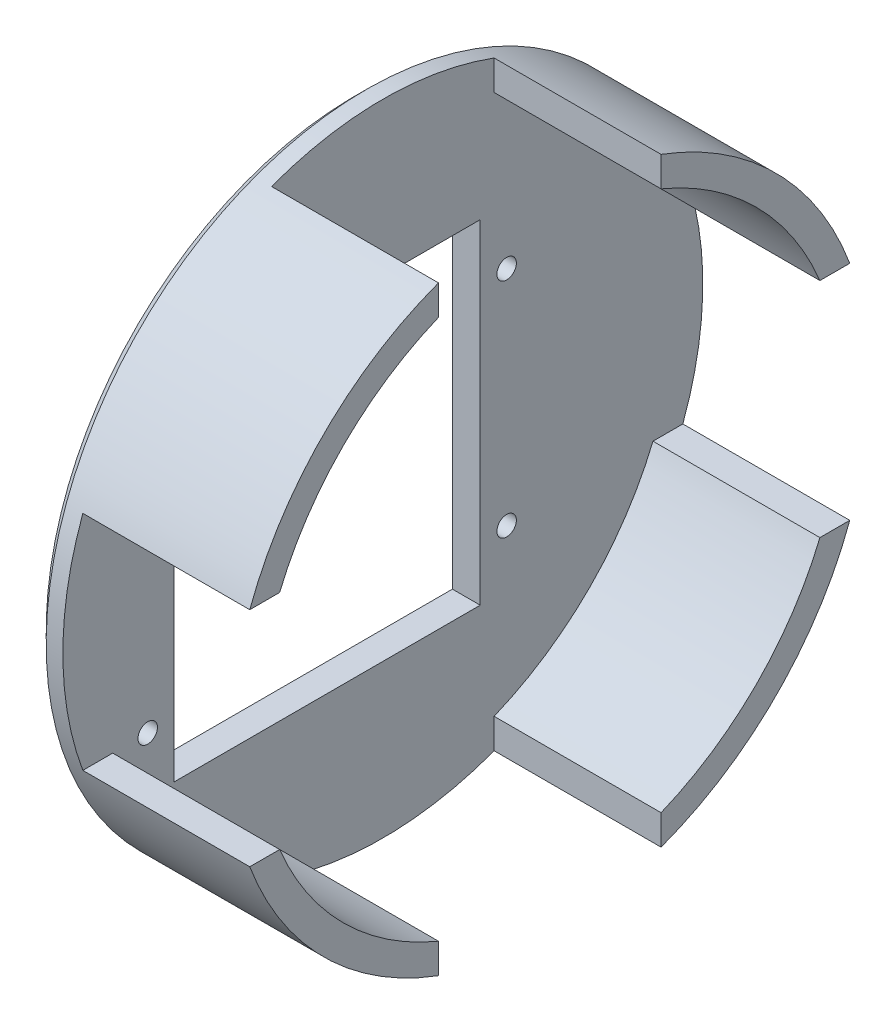
ISO-10303-21;
HEADER;
FILE_DESCRIPTION(('STEP AP214'),'2;1');
FILE_NAME('part.step','',(''),(''),'','','');
FILE_SCHEMA(('AUTOMOTIVE_DESIGN { 1 0 10303 214 1 1 1 1 }'));
ENDSEC;
DATA;
#1=APPLICATION_CONTEXT('core data for automotive mechanical design processes');
#2=APPLICATION_PROTOCOL_DEFINITION('international standard','automotive_design',2000,#1);
#3=PRODUCT_CONTEXT('',#1,'mechanical');
#4=PRODUCT('Part','Part','',(#3));
#5=PRODUCT_RELATED_PRODUCT_CATEGORY('part','',(#4));
#6=PRODUCT_DEFINITION_FORMATION('','',#4);
#7=PRODUCT_DEFINITION_CONTEXT('part definition',#1,'design');
#8=PRODUCT_DEFINITION('design','',#6,#7);
#9=PRODUCT_DEFINITION_SHAPE('','',#8);
#10=(LENGTH_UNIT() NAMED_UNIT(*) SI_UNIT(.MILLI.,.METRE.));
#11=(NAMED_UNIT(*) PLANE_ANGLE_UNIT() SI_UNIT($,.RADIAN.));
#12=(NAMED_UNIT(*) SI_UNIT($,.STERADIAN.) SOLID_ANGLE_UNIT());
#13=UNCERTAINTY_MEASURE_WITH_UNIT(LENGTH_MEASURE(1.E-05),#10,'distance_accuracy_value','');
#14=(GEOMETRIC_REPRESENTATION_CONTEXT(3) GLOBAL_UNCERTAINTY_ASSIGNED_CONTEXT((#13)) GLOBAL_UNIT_ASSIGNED_CONTEXT((#10,
#11,#12)) REPRESENTATION_CONTEXT('',''));
#15=CARTESIAN_POINT('',(0.,0.,0.));
#16=DIRECTION('',(0.,0.,1.));
#17=DIRECTION('',(1.,0.,0.));
#18=AXIS2_PLACEMENT_3D('',#15,#16,#17);
#19=CARTESIAN_POINT('',(5.,0.,0.));
#20=DIRECTION('',(-1.,0.,0.));
#21=DIRECTION('',(0.,0.,1.));
#22=AXIS2_PLACEMENT_3D('',#19,#20,#21);
#23=CYLINDRICAL_SURFACE('',#22,57.5);
#24=CARTESIAN_POINT('',(2.00000000000003,0.,0.));
#25=DIRECTION('',(1.,0.,0.));
#26=DIRECTION('',(0.,0.,-1.));
#27=AXIS2_PLACEMENT_3D('',#24,#25,#26);
#28=CIRCLE('',#27,57.5);
#29=CARTESIAN_POINT('',(2.00000000000003,0.,-57.5));
#30=VERTEX_POINT('',#29);
#31=EDGE_CURVE('E48',#30,#30,#28,.T.);
#32=ORIENTED_EDGE('',*,*,#31,.T.);
#33=EDGE_LOOP('',(#32));
#34=FACE_BOUND('',#33,.T.);
#35=DIRECTION('',(1.,0.,0.));
#36=VECTOR('',#35,1.);
#37=CARTESIAN_POINT('',(5.,20.,53.9096466321196));
#38=LINE('',#37,#36);
#39=CARTESIAN_POINT('',(5.,20.,53.9096466321196));
#40=VERTEX_POINT('',#39);
#41=CARTESIAN_POINT('',(35.,20.,53.9096466321196));
#42=VERTEX_POINT('',#41);
#43=EDGE_CURVE('E177',#40,#42,#38,.T.);
#44=ORIENTED_EDGE('',*,*,#43,.T.);
#45=CARTESIAN_POINT('',(35.,0.,0.));
#46=DIRECTION('',(1.,0.,0.));
#47=DIRECTION('',(0.,0.,-1.));
#48=AXIS2_PLACEMENT_3D('',#45,#46,#47);
#49=CIRCLE('',#48,57.5);
#50=CARTESIAN_POINT('',(35.,53.9096466321196,20.));
#51=VERTEX_POINT('',#50);
#52=EDGE_CURVE('E342',#51,#42,#49,.T.);
#53=ORIENTED_EDGE('',*,*,#52,.F.);
#54=DIRECTION('',(1.,0.,0.));
#55=VECTOR('',#54,1.);
#56=CARTESIAN_POINT('',(5.,53.9096466321196,20.));
#57=LINE('',#56,#55);
#58=CARTESIAN_POINT('',(5.,53.9096466321196,20.));
#59=VERTEX_POINT('',#58);
#60=EDGE_CURVE('E230',#59,#51,#57,.T.);
#61=ORIENTED_EDGE('',*,*,#60,.F.);
#62=CARTESIAN_POINT('',(5.,0.,0.));
#63=DIRECTION('',(1.,0.,0.));
#64=DIRECTION('',(0.,0.,-1.));
#65=AXIS2_PLACEMENT_3D('',#62,#63,#64);
#66=CIRCLE('',#65,57.5);
#67=CARTESIAN_POINT('',(5.,53.9096466321196,-20.));
#68=VERTEX_POINT('',#67);
#69=EDGE_CURVE('E216',#68,#59,#66,.T.);
#70=ORIENTED_EDGE('',*,*,#69,.F.);
#71=DIRECTION('',(1.,0.,0.));
#72=VECTOR('',#71,1.);
#73=CARTESIAN_POINT('',(5.,53.9096466321196,-20.));
#74=LINE('',#73,#72);
#75=CARTESIAN_POINT('',(35.,53.9096466321196,-20.));
#76=VERTEX_POINT('',#75);
#77=EDGE_CURVE('E220',#68,#76,#74,.T.);
#78=ORIENTED_EDGE('',*,*,#77,.T.);
#79=CARTESIAN_POINT('',(35.,20.,-53.9096466321196));
#80=VERTEX_POINT('',#79);
#81=EDGE_CURVE('E338',#80,#76,#49,.T.);
#82=ORIENTED_EDGE('',*,*,#81,.F.);
#83=DIRECTION('',(1.,0.,0.));
#84=VECTOR('',#83,1.);
#85=CARTESIAN_POINT('',(5.,20.,-53.9096466321196));
#86=LINE('',#85,#84);
#87=CARTESIAN_POINT('',(5.,20.,-53.9096466321196));
#88=VERTEX_POINT('',#87);
#89=EDGE_CURVE('E251',#88,#80,#86,.T.);
#90=ORIENTED_EDGE('',*,*,#89,.F.);
#91=CARTESIAN_POINT('',(5.,0.,0.));
#92=DIRECTION('',(1.,0.,0.));
#93=DIRECTION('',(0.,0.,-1.));
#94=AXIS2_PLACEMENT_3D('',#91,#92,#93);
#95=CIRCLE('',#94,57.5);
#96=CARTESIAN_POINT('',(5.,-20.,-53.9096466321196));
#97=VERTEX_POINT('',#96);
#98=EDGE_CURVE('E237',#97,#88,#95,.T.);
#99=ORIENTED_EDGE('',*,*,#98,.F.);
#100=DIRECTION('',(1.,0.,0.));
#101=VECTOR('',#100,1.);
#102=CARTESIAN_POINT('',(5.,-20.,-53.9096466321196));
#103=LINE('',#102,#101);
#104=CARTESIAN_POINT('',(35.,-20.,-53.9096466321196));
#105=VERTEX_POINT('',#104);
#106=EDGE_CURVE('E241',#97,#105,#103,.T.);
#107=ORIENTED_EDGE('',*,*,#106,.T.);
#108=CARTESIAN_POINT('',(35.,-53.9096466321196,-20.));
#109=VERTEX_POINT('',#108);
#110=EDGE_CURVE('E336',#109,#105,#49,.T.);
#111=ORIENTED_EDGE('',*,*,#110,.F.);
#112=DIRECTION('',(1.,0.,0.));
#113=VECTOR('',#112,1.);
#114=CARTESIAN_POINT('',(5.,-53.9096466321196,-20.));
#115=LINE('',#114,#113);
#116=CARTESIAN_POINT('',(5.,-53.9096466321196,-20.));
#117=VERTEX_POINT('',#116);
#118=EDGE_CURVE('E264',#117,#109,#115,.T.);
#119=ORIENTED_EDGE('',*,*,#118,.F.);
#120=CARTESIAN_POINT('',(5.,0.,0.));
#121=DIRECTION('',(1.,0.,0.));
#122=DIRECTION('',(0.,0.,-1.));
#123=AXIS2_PLACEMENT_3D('',#120,#121,#122);
#124=CIRCLE('',#123,57.5);
#125=CARTESIAN_POINT('',(5.,-53.9096466321196,20.));
#126=VERTEX_POINT('',#125);
#127=EDGE_CURVE('E255',#126,#117,#124,.T.);
#128=ORIENTED_EDGE('',*,*,#127,.F.);
#129=DIRECTION('',(1.,0.,0.));
#130=VECTOR('',#129,1.);
#131=CARTESIAN_POINT('',(5.,-53.9096466321196,20.));
#132=LINE('',#131,#130);
#133=CARTESIAN_POINT('',(35.,-53.9096466321196,20.));
#134=VERTEX_POINT('',#133);
#135=EDGE_CURVE('E244',#126,#134,#132,.T.);
#136=ORIENTED_EDGE('',*,*,#135,.T.);
#137=CARTESIAN_POINT('',(35.,-20.0000000000001,53.9096466321195));
#138=VERTEX_POINT('',#137);
#139=EDGE_CURVE('E642',#138,#134,#49,.T.);
#140=ORIENTED_EDGE('',*,*,#139,.F.);
#141=DIRECTION('',(1.,0.,0.));
#142=VECTOR('',#141,1.);
#143=CARTESIAN_POINT('',(5.,-20.0000000000001,53.9096466321195));
#144=LINE('',#143,#142);
#145=CARTESIAN_POINT('',(5.,-20.0000000000001,53.9096466321195));
#146=VERTEX_POINT('',#145);
#147=EDGE_CURVE('E188',#146,#138,#144,.T.);
#148=ORIENTED_EDGE('',*,*,#147,.F.);
#149=CARTESIAN_POINT('',(5.,0.,0.));
#150=DIRECTION('',(1.,0.,0.));
#151=DIRECTION('',(0.,0.,-1.));
#152=AXIS2_PLACEMENT_3D('',#149,#150,#151);
#153=CIRCLE('',#152,57.5);
#154=EDGE_CURVE('E194',#40,#146,#153,.T.);
#155=ORIENTED_EDGE('',*,*,#154,.F.);
#156=EDGE_LOOP('',(#44,#53,#61,#70,#78,#82,#90,#99,#107,#111,#119,#128,#136,#140,#148,#155));
#157=FACE_BOUND('',#156,.T.);
#158=ADVANCED_FACE('F39',(#34,#157),#23,.T.);
#159=CARTESIAN_POINT('',(35.,0.,0.));
#160=DIRECTION('',(1.,0.,0.));
#161=DIRECTION('',(0.,0.,-1.));
#162=AXIS2_PLACEMENT_3D('',#159,#160,#161);
#163=PLANE('',#162);
#164=ORIENTED_EDGE('',*,*,#52,.T.);
#165=DIRECTION('',(0.,0.,-1.));
#166=VECTOR('',#165,1.);
#167=CARTESIAN_POINT('',(35.,20.,0.));
#168=LINE('',#167,#166);
#169=CARTESIAN_POINT('',(35.,20.,48.541219597369));
#170=VERTEX_POINT('',#169);
#171=EDGE_CURVE('E183',#42,#170,#168,.T.);
#172=ORIENTED_EDGE('',*,*,#171,.T.);
#173=CARTESIAN_POINT('',(35.,0.,0.));
#174=DIRECTION('',(1.,0.,0.));
#175=DIRECTION('',(0.,0.,-1.));
#176=AXIS2_PLACEMENT_3D('',#173,#174,#175);
#177=CIRCLE('',#176,52.5);
#178=CARTESIAN_POINT('',(35.,48.541219597369,20.));
#179=VERTEX_POINT('',#178);
#180=EDGE_CURVE('E337',#179,#170,#177,.T.);
#181=ORIENTED_EDGE('',*,*,#180,.F.);
#182=DIRECTION('',(0.,-1.,0.));
#183=VECTOR('',#182,1.);
#184=CARTESIAN_POINT('',(35.,0.,20.));
#185=LINE('',#184,#183);
#186=EDGE_CURVE('E217',#51,#179,#185,.T.);
#187=ORIENTED_EDGE('',*,*,#186,.F.);
#188=EDGE_LOOP('',(#164,#172,#181,#187));
#189=FACE_BOUND('',#188,.T.);
#190=ADVANCED_FACE('F360',(#189),#163,.T.);
#191=ORIENTED_EDGE('',*,*,#81,.T.);
#192=DIRECTION('',(0.,-1.,0.));
#193=VECTOR('',#192,1.);
#194=CARTESIAN_POINT('',(35.,0.,-20.));
#195=LINE('',#194,#193);
#196=CARTESIAN_POINT('',(35.,48.541219597369,-20.));
#197=VERTEX_POINT('',#196);
#198=EDGE_CURVE('E221',#76,#197,#195,.T.);
#199=ORIENTED_EDGE('',*,*,#198,.T.);
#200=CARTESIAN_POINT('',(35.,20.,-48.541219597369));
#201=VERTEX_POINT('',#200);
#202=EDGE_CURVE('E333',#201,#197,#177,.T.);
#203=ORIENTED_EDGE('',*,*,#202,.F.);
#204=DIRECTION('',(0.,0.,-1.));
#205=VECTOR('',#204,1.);
#206=CARTESIAN_POINT('',(35.,20.,0.));
#207=LINE('',#206,#205);
#208=EDGE_CURVE('E238',#201,#80,#207,.T.);
#209=ORIENTED_EDGE('',*,*,#208,.T.);
#210=EDGE_LOOP('',(#191,#199,#203,#209));
#211=FACE_BOUND('',#210,.T.);
#212=ADVANCED_FACE('F364',(#211),#163,.T.);
#213=DIRECTION('',(0.,0.,-1.));
#214=VECTOR('',#213,1.);
#215=CARTESIAN_POINT('',(35.,-20.,0.));
#216=LINE('',#215,#214);
#217=CARTESIAN_POINT('',(35.,-20.,48.541219597369));
#218=VERTEX_POINT('',#217);
#219=EDGE_CURVE('E198',#138,#218,#216,.T.);
#220=ORIENTED_EDGE('',*,*,#219,.F.);
#221=ORIENTED_EDGE('',*,*,#139,.T.);
#222=DIRECTION('',(0.,-1.,0.));
#223=VECTOR('',#222,1.);
#224=CARTESIAN_POINT('',(35.,0.,20.));
#225=LINE('',#224,#223);
#226=CARTESIAN_POINT('',(35.,-48.541219597369,20.));
#227=VERTEX_POINT('',#226);
#228=EDGE_CURVE('E259',#227,#134,#225,.T.);
#229=ORIENTED_EDGE('',*,*,#228,.F.);
#230=EDGE_CURVE('E643',#218,#227,#177,.T.);
#231=ORIENTED_EDGE('',*,*,#230,.F.);
#232=EDGE_LOOP('',(#220,#221,#229,#231));
#233=FACE_BOUND('',#232,.T.);
#234=ADVANCED_FACE('F381',(#233),#163,.T.);
#235=CARTESIAN_POINT('',(35.,0.,0.));
#236=DIRECTION('',(-1.,0.,0.));
#237=DIRECTION('',(0.,0.,1.));
#238=AXIS2_PLACEMENT_3D('',#235,#236,#237);
#239=CYLINDRICAL_SURFACE('',#238,52.5);
#240=ORIENTED_EDGE('',*,*,#180,.T.);
#241=DIRECTION('',(1.,0.,0.));
#242=VECTOR('',#241,1.);
#243=CARTESIAN_POINT('',(5.,20.,48.541219597369));
#244=LINE('',#243,#242);
#245=CARTESIAN_POINT('',(5.,20.,48.541219597369));
#246=VERTEX_POINT('',#245);
#247=EDGE_CURVE('E207',#246,#170,#244,.T.);
#248=ORIENTED_EDGE('',*,*,#247,.F.);
#249=CARTESIAN_POINT('',(5.,0.,0.));
#250=DIRECTION('',(1.,0.,0.));
#251=DIRECTION('',(0.,0.,-1.));
#252=AXIS2_PLACEMENT_3D('',#249,#250,#251);
#253=CIRCLE('',#252,52.5);
#254=CARTESIAN_POINT('',(5.,48.541219597369,20.));
#255=VERTEX_POINT('',#254);
#256=EDGE_CURVE('E197',#246,#255,#253,.F.);
#257=ORIENTED_EDGE('',*,*,#256,.T.);
#258=DIRECTION('',(1.,0.,0.));
#259=VECTOR('',#258,1.);
#260=CARTESIAN_POINT('',(5.,48.541219597369,20.));
#261=LINE('',#260,#259);
#262=EDGE_CURVE('E227',#255,#179,#261,.T.);
#263=ORIENTED_EDGE('',*,*,#262,.T.);
#264=EDGE_LOOP('',(#240,#248,#257,#263));
#265=FACE_BOUND('',#264,.T.);
#266=ADVANCED_FACE('F385',(#265),#239,.F.);
#267=ORIENTED_EDGE('',*,*,#202,.T.);
#268=DIRECTION('',(1.,0.,0.));
#269=VECTOR('',#268,1.);
#270=CARTESIAN_POINT('',(5.,48.541219597369,-20.));
#271=LINE('',#270,#269);
#272=CARTESIAN_POINT('',(5.,48.541219597369,-20.));
#273=VERTEX_POINT('',#272);
#274=EDGE_CURVE('E205',#273,#197,#271,.T.);
#275=ORIENTED_EDGE('',*,*,#274,.F.);
#276=CARTESIAN_POINT('',(5.,20.,-48.541219597369));
#277=VERTEX_POINT('',#276);
#278=EDGE_CURVE('E341',#273,#277,#253,.F.);
#279=ORIENTED_EDGE('',*,*,#278,.T.);
#280=DIRECTION('',(1.,0.,0.));
#281=VECTOR('',#280,1.);
#282=CARTESIAN_POINT('',(5.,20.,-48.541219597369));
#283=LINE('',#282,#281);
#284=EDGE_CURVE('E248',#277,#201,#283,.T.);
#285=ORIENTED_EDGE('',*,*,#284,.T.);
#286=EDGE_LOOP('',(#267,#275,#279,#285));
#287=FACE_BOUND('',#286,.T.);
#288=ADVANCED_FACE('F583',(#287),#239,.F.);
#289=DIRECTION('',(1.,0.,0.));
#290=VECTOR('',#289,1.);
#291=CARTESIAN_POINT('',(5.,-20.,48.541219597369));
#292=LINE('',#291,#290);
#293=CARTESIAN_POINT('',(5.,-20.,48.541219597369));
#294=VERTEX_POINT('',#293);
#295=EDGE_CURVE('E210',#294,#218,#292,.T.);
#296=ORIENTED_EDGE('',*,*,#295,.T.);
#297=ORIENTED_EDGE('',*,*,#230,.T.);
#298=DIRECTION('',(1.,0.,0.));
#299=VECTOR('',#298,1.);
#300=CARTESIAN_POINT('',(5.,-48.541219597369,20.));
#301=LINE('',#300,#299);
#302=CARTESIAN_POINT('',(5.,-48.541219597369,20.));
#303=VERTEX_POINT('',#302);
#304=EDGE_CURVE('E271',#303,#227,#301,.T.);
#305=ORIENTED_EDGE('',*,*,#304,.F.);
#306=EDGE_CURVE('E345',#303,#294,#253,.F.);
#307=ORIENTED_EDGE('',*,*,#306,.T.);
#308=EDGE_LOOP('',(#296,#297,#305,#307));
#309=FACE_BOUND('',#308,.T.);
#310=ADVANCED_FACE('F372',(#309),#239,.F.);
#311=CARTESIAN_POINT('',(0.,0.,0.));
#312=DIRECTION('',(1.,0.,0.));
#313=DIRECTION('',(0.,0.,-1.));
#314=AXIS2_PLACEMENT_3D('',#311,#312,#313);
#315=PLANE('',#314);
#316=CARTESIAN_POINT('',(0.,0.,0.));
#317=DIRECTION('',(1.,0.,0.));
#318=DIRECTION('',(0.,0.,-1.));
#319=AXIS2_PLACEMENT_3D('',#316,#317,#318);
#320=CIRCLE('',#319,55.5);
#321=CARTESIAN_POINT('',(0.,0.,-55.5));
#322=VERTEX_POINT('',#321);
#323=EDGE_CURVE('E11',#322,#322,#320,.F.);
#324=ORIENTED_EDGE('',*,*,#323,.T.);
#325=EDGE_LOOP('',(#324));
#326=FACE_BOUND('',#325,.T.);
#327=CARTESIAN_POINT('',(0.,-20.,42.25));
#328=DIRECTION('',(1.,0.,0.));
#329=DIRECTION('',(0.,0.,1.));
#330=AXIS2_PLACEMENT_3D('',#327,#328,#329);
#331=CIRCLE('',#330,1.75);
#332=CARTESIAN_POINT('',(0.,-20.,44.));
#333=VERTEX_POINT('',#332);
#334=EDGE_CURVE('E315',#333,#333,#331,.T.);
#335=ORIENTED_EDGE('',*,*,#334,.T.);
#336=EDGE_LOOP('',(#335));
#337=FACE_BOUND('',#336,.T.);
#338=CARTESIAN_POINT('',(0.,20.,-22.25));
#339=DIRECTION('',(1.,0.,0.));
#340=DIRECTION('',(0.,0.,1.));
#341=AXIS2_PLACEMENT_3D('',#338,#339,#340);
#342=CIRCLE('',#341,1.75);
#343=CARTESIAN_POINT('',(0.,20.,-20.5));
#344=VERTEX_POINT('',#343);
#345=EDGE_CURVE('E322',#344,#344,#342,.T.);
#346=ORIENTED_EDGE('',*,*,#345,.T.);
#347=EDGE_LOOP('',(#346));
#348=FACE_BOUND('',#347,.T.);
#349=CARTESIAN_POINT('',(0.,-20.,-22.25));
#350=DIRECTION('',(1.,0.,0.));
#351=DIRECTION('',(0.,0.,-1.));
#352=AXIS2_PLACEMENT_3D('',#349,#350,#351);
#353=CIRCLE('',#352,1.75);
#354=CARTESIAN_POINT('',(0.,-20.,-24.));
#355=VERTEX_POINT('',#354);
#356=EDGE_CURVE('E277',#355,#355,#353,.T.);
#357=ORIENTED_EDGE('',*,*,#356,.T.);
#358=EDGE_LOOP('',(#357));
#359=FACE_BOUND('',#358,.T.);
#360=DIRECTION('',(0.,0.,-1.));
#361=VECTOR('',#360,1.);
#362=CARTESIAN_POINT('',(0.,-30.,37.5));
#363=LINE('',#362,#361);
#364=CARTESIAN_POINT('',(0.,-30.,37.5));
#365=VERTEX_POINT('',#364);
#366=CARTESIAN_POINT('',(0.,-30.,-17.5));
#367=VERTEX_POINT('',#366);
#368=EDGE_CURVE('E295',#365,#367,#363,.T.);
#369=ORIENTED_EDGE('',*,*,#368,.T.);
#370=DIRECTION('',(0.,1.,0.));
#371=VECTOR('',#370,1.);
#372=CARTESIAN_POINT('',(0.,30.,-17.5));
#373=LINE('',#372,#371);
#374=CARTESIAN_POINT('',(0.,30.,-17.5));
#375=VERTEX_POINT('',#374);
#376=EDGE_CURVE('E285',#367,#375,#373,.T.);
#377=ORIENTED_EDGE('',*,*,#376,.T.);
#378=DIRECTION('',(0.,0.,1.));
#379=VECTOR('',#378,1.);
#380=CARTESIAN_POINT('',(0.,30.,37.5));
#381=LINE('',#380,#379);
#382=CARTESIAN_POINT('',(0.,30.,37.5));
#383=VERTEX_POINT('',#382);
#384=EDGE_CURVE('E288',#375,#383,#381,.T.);
#385=ORIENTED_EDGE('',*,*,#384,.T.);
#386=DIRECTION('',(0.,-1.,0.));
#387=VECTOR('',#386,1.);
#388=CARTESIAN_POINT('',(0.,30.,37.5));
#389=LINE('',#388,#387);
#390=EDGE_CURVE('E292',#383,#365,#389,.T.);
#391=ORIENTED_EDGE('',*,*,#390,.T.);
#392=EDGE_LOOP('',(#369,#377,#385,#391));
#393=FACE_BOUND('',#392,.T.);
#394=CARTESIAN_POINT('',(0.,20.,42.25));
#395=DIRECTION('',(1.,0.,0.));
#396=DIRECTION('',(0.,0.,-1.));
#397=AXIS2_PLACEMENT_3D('',#394,#395,#396);
#398=CIRCLE('',#397,1.75);
#399=CARTESIAN_POINT('',(0.,20.,40.5));
#400=VERTEX_POINT('',#399);
#401=EDGE_CURVE('E327',#400,#400,#398,.T.);
#402=ORIENTED_EDGE('',*,*,#401,.T.);
#403=EDGE_LOOP('',(#402));
#404=FACE_BOUND('',#403,.T.);
#405=ADVANCED_FACE('F369',(#326,#337,#348,#359,#393,#404),#315,.F.);
#406=DIRECTION('',(0.,0.,-1.));
#407=VECTOR('',#406,1.);
#408=CARTESIAN_POINT('',(35.,-20.,0.));
#409=LINE('',#408,#407);
#410=CARTESIAN_POINT('',(35.,-20.,-48.541219597369));
#411=VERTEX_POINT('',#410);
#412=EDGE_CURVE('E242',#411,#105,#409,.T.);
#413=ORIENTED_EDGE('',*,*,#412,.F.);
#414=CARTESIAN_POINT('',(35.,-48.541219597369,-20.));
#415=VERTEX_POINT('',#414);
#416=EDGE_CURVE('E330',#415,#411,#177,.T.);
#417=ORIENTED_EDGE('',*,*,#416,.F.);
#418=DIRECTION('',(0.,-1.,0.));
#419=VECTOR('',#418,1.);
#420=CARTESIAN_POINT('',(35.,0.,-20.));
#421=LINE('',#420,#419);
#422=EDGE_CURVE('E265',#415,#109,#421,.T.);
#423=ORIENTED_EDGE('',*,*,#422,.T.);
#424=ORIENTED_EDGE('',*,*,#110,.T.);
#425=EDGE_LOOP('',(#413,#417,#423,#424));
#426=FACE_BOUND('',#425,.T.);
#427=ADVANCED_FACE('F367',(#426),#163,.T.);
#428=DIRECTION('',(1.,0.,0.));
#429=VECTOR('',#428,1.);
#430=CARTESIAN_POINT('',(5.,-20.,-48.541219597369));
#431=LINE('',#430,#429);
#432=CARTESIAN_POINT('',(5.,-20.,-48.541219597369));
#433=VERTEX_POINT('',#432);
#434=EDGE_CURVE('E224',#433,#411,#431,.T.);
#435=ORIENTED_EDGE('',*,*,#434,.F.);
#436=CARTESIAN_POINT('',(5.,-48.541219597369,-20.));
#437=VERTEX_POINT('',#436);
#438=EDGE_CURVE('E343',#433,#437,#253,.F.);
#439=ORIENTED_EDGE('',*,*,#438,.T.);
#440=DIRECTION('',(1.,0.,0.));
#441=VECTOR('',#440,1.);
#442=CARTESIAN_POINT('',(5.,-48.541219597369,-20.));
#443=LINE('',#442,#441);
#444=EDGE_CURVE('E273',#437,#415,#443,.T.);
#445=ORIENTED_EDGE('',*,*,#444,.T.);
#446=ORIENTED_EDGE('',*,*,#416,.T.);
#447=EDGE_LOOP('',(#435,#439,#445,#446));
#448=FACE_BOUND('',#447,.T.);
#449=ADVANCED_FACE('F376',(#448),#239,.F.);
#450=CARTESIAN_POINT('',(5.,0.,0.));
#451=DIRECTION('',(1.,0.,0.));
#452=DIRECTION('',(0.,0.,-1.));
#453=AXIS2_PLACEMENT_3D('',#450,#451,#452);
#454=PLANE('',#453);
#455=DIRECTION('',(0.,1.,0.));
#456=VECTOR('',#455,1.);
#457=CARTESIAN_POINT('',(5.,30.,-17.5));
#458=LINE('',#457,#456);
#459=CARTESIAN_POINT('',(5.,-30.,-17.5));
#460=VERTEX_POINT('',#459);
#461=CARTESIAN_POINT('',(5.,30.,-17.5));
#462=VERTEX_POINT('',#461);
#463=EDGE_CURVE('E209',#460,#462,#458,.T.);
#464=ORIENTED_EDGE('',*,*,#463,.F.);
#465=DIRECTION('',(0.,0.,-1.));
#466=VECTOR('',#465,1.);
#467=CARTESIAN_POINT('',(5.,-30.,37.5));
#468=LINE('',#467,#466);
#469=CARTESIAN_POINT('',(5.,-30.,37.5));
#470=VERTEX_POINT('',#469);
#471=EDGE_CURVE('E289',#470,#460,#468,.T.);
#472=ORIENTED_EDGE('',*,*,#471,.F.);
#473=DIRECTION('',(0.,-1.,0.));
#474=VECTOR('',#473,1.);
#475=CARTESIAN_POINT('',(5.,30.,37.5));
#476=LINE('',#475,#474);
#477=CARTESIAN_POINT('',(5.,30.,37.5));
#478=VERTEX_POINT('',#477);
#479=EDGE_CURVE('E304',#478,#470,#476,.T.);
#480=ORIENTED_EDGE('',*,*,#479,.F.);
#481=DIRECTION('',(0.,0.,1.));
#482=VECTOR('',#481,1.);
#483=CARTESIAN_POINT('',(5.,30.,37.5));
#484=LINE('',#483,#482);
#485=EDGE_CURVE('E301',#462,#478,#484,.T.);
#486=ORIENTED_EDGE('',*,*,#485,.F.);
#487=EDGE_LOOP('',(#464,#472,#480,#486));
#488=FACE_BOUND('',#487,.T.);
#489=CARTESIAN_POINT('',(5.,-20.,42.25));
#490=DIRECTION('',(1.,0.,0.));
#491=DIRECTION('',(0.,0.,1.));
#492=AXIS2_PLACEMENT_3D('',#489,#490,#491);
#493=CIRCLE('',#492,1.75);
#494=CARTESIAN_POINT('',(5.,-20.,44.));
#495=VERTEX_POINT('',#494);
#496=EDGE_CURVE('E319',#495,#495,#493,.T.);
#497=ORIENTED_EDGE('',*,*,#496,.F.);
#498=EDGE_LOOP('',(#497));
#499=FACE_BOUND('',#498,.T.);
#500=CARTESIAN_POINT('',(5.,20.,-22.25));
#501=DIRECTION('',(1.,0.,0.));
#502=DIRECTION('',(0.,0.,1.));
#503=AXIS2_PLACEMENT_3D('',#500,#501,#502);
#504=CIRCLE('',#503,1.75);
#505=CARTESIAN_POINT('',(5.,20.,-20.5));
#506=VERTEX_POINT('',#505);
#507=EDGE_CURVE('E280',#506,#506,#504,.T.);
#508=ORIENTED_EDGE('',*,*,#507,.F.);
#509=EDGE_LOOP('',(#508));
#510=FACE_BOUND('',#509,.T.);
#511=CARTESIAN_POINT('',(5.,-20.,-22.25));
#512=DIRECTION('',(1.,0.,0.));
#513=DIRECTION('',(0.,0.,-1.));
#514=AXIS2_PLACEMENT_3D('',#511,#512,#513);
#515=CIRCLE('',#514,1.75);
#516=CARTESIAN_POINT('',(5.,-20.,-24.));
#517=VERTEX_POINT('',#516);
#518=EDGE_CURVE('E281',#517,#517,#515,.T.);
#519=ORIENTED_EDGE('',*,*,#518,.F.);
#520=EDGE_LOOP('',(#519));
#521=FACE_BOUND('',#520,.T.);
#522=CARTESIAN_POINT('',(5.,20.,42.25));
#523=DIRECTION('',(1.,0.,0.));
#524=DIRECTION('',(0.,0.,-1.));
#525=AXIS2_PLACEMENT_3D('',#522,#523,#524);
#526=CIRCLE('',#525,1.75);
#527=CARTESIAN_POINT('',(5.,20.,40.5));
#528=VERTEX_POINT('',#527);
#529=EDGE_CURVE('E318',#528,#528,#526,.T.);
#530=ORIENTED_EDGE('',*,*,#529,.F.);
#531=EDGE_LOOP('',(#530));
#532=FACE_BOUND('',#531,.T.);
#533=ORIENTED_EDGE('',*,*,#438,.F.);
#534=DIRECTION('',(0.,0.,-1.));
#535=VECTOR('',#534,1.);
#536=CARTESIAN_POINT('',(5.,-20.,0.));
#537=LINE('',#536,#535);
#538=EDGE_CURVE('E234',#433,#97,#537,.T.);
#539=ORIENTED_EDGE('',*,*,#538,.T.);
#540=ORIENTED_EDGE('',*,*,#98,.T.);
#541=DIRECTION('',(0.,0.,-1.));
#542=VECTOR('',#541,1.);
#543=CARTESIAN_POINT('',(5.,20.,0.));
#544=LINE('',#543,#542);
#545=EDGE_CURVE('E55',#277,#88,#544,.T.);
#546=ORIENTED_EDGE('',*,*,#545,.F.);
#547=ORIENTED_EDGE('',*,*,#278,.F.);
#548=DIRECTION('',(0.,-1.,0.));
#549=VECTOR('',#548,1.);
#550=CARTESIAN_POINT('',(5.,0.,-20.));
#551=LINE('',#550,#549);
#552=EDGE_CURVE('E214',#68,#273,#551,.T.);
#553=ORIENTED_EDGE('',*,*,#552,.F.);
#554=ORIENTED_EDGE('',*,*,#69,.T.);
#555=DIRECTION('',(0.,-1.,0.));
#556=VECTOR('',#555,1.);
#557=CARTESIAN_POINT('',(5.,0.,20.));
#558=LINE('',#557,#556);
#559=EDGE_CURVE('E62',#59,#255,#558,.T.);
#560=ORIENTED_EDGE('',*,*,#559,.T.);
#561=ORIENTED_EDGE('',*,*,#256,.F.);
#562=DIRECTION('',(0.,0.,-1.));
#563=VECTOR('',#562,1.);
#564=CARTESIAN_POINT('',(5.,20.,0.));
#565=LINE('',#564,#563);
#566=EDGE_CURVE('E180',#40,#246,#565,.T.);
#567=ORIENTED_EDGE('',*,*,#566,.F.);
#568=ORIENTED_EDGE('',*,*,#154,.T.);
#569=DIRECTION('',(0.,0.,-1.));
#570=VECTOR('',#569,1.);
#571=CARTESIAN_POINT('',(5.,-20.,0.));
#572=LINE('',#571,#570);
#573=EDGE_CURVE('E189',#146,#294,#572,.T.);
#574=ORIENTED_EDGE('',*,*,#573,.T.);
#575=ORIENTED_EDGE('',*,*,#306,.F.);
#576=DIRECTION('',(0.,-1.,0.));
#577=VECTOR('',#576,1.);
#578=CARTESIAN_POINT('',(5.,0.,20.));
#579=LINE('',#578,#577);
#580=EDGE_CURVE('E261',#303,#126,#579,.T.);
#581=ORIENTED_EDGE('',*,*,#580,.T.);
#582=ORIENTED_EDGE('',*,*,#127,.T.);
#583=DIRECTION('',(0.,-1.,0.));
#584=VECTOR('',#583,1.);
#585=CARTESIAN_POINT('',(5.,0.,-20.));
#586=LINE('',#585,#584);
#587=EDGE_CURVE('E258',#437,#117,#586,.T.);
#588=ORIENTED_EDGE('',*,*,#587,.F.);
#589=EDGE_LOOP('',(#533,#539,#540,#546,#547,#553,#554,#560,#561,#567,#568,#574,#575,#581,#582,#588));
#590=FACE_BOUND('',#589,.T.);
#591=ADVANCED_FACE('F193',(#488,#499,#510,#521,#532,#590),#454,.T.);
#592=CARTESIAN_POINT('',(0.,20.,42.25));
#593=DIRECTION('',(1.,0.,0.));
#594=DIRECTION('',(0.,0.,-1.));
#595=AXIS2_PLACEMENT_3D('',#592,#593,#594);
#596=CYLINDRICAL_SURFACE('',#595,1.75);
#597=ORIENTED_EDGE('',*,*,#401,.F.);
#598=EDGE_LOOP('',(#597));
#599=FACE_BOUND('',#598,.T.);
#600=ORIENTED_EDGE('',*,*,#529,.T.);
#601=EDGE_LOOP('',(#600));
#602=FACE_BOUND('',#601,.T.);
#603=ADVANCED_FACE('F375',(#599,#602),#596,.F.);
#604=CARTESIAN_POINT('',(0.,-20.,-22.25));
#605=DIRECTION('',(1.,0.,0.));
#606=DIRECTION('',(0.,0.,-1.));
#607=AXIS2_PLACEMENT_3D('',#604,#605,#606);
#608=CYLINDRICAL_SURFACE('',#607,1.75);
#609=ORIENTED_EDGE('',*,*,#356,.F.);
#610=EDGE_LOOP('',(#609));
#611=FACE_BOUND('',#610,.T.);
#612=ORIENTED_EDGE('',*,*,#518,.T.);
#613=EDGE_LOOP('',(#612));
#614=FACE_BOUND('',#613,.T.);
#615=ADVANCED_FACE('F388',(#611,#614),#608,.F.);
#616=CARTESIAN_POINT('',(0.,20.,-22.25));
#617=DIRECTION('',(1.,0.,0.));
#618=DIRECTION('',(0.,0.,-1.));
#619=AXIS2_PLACEMENT_3D('',#616,#617,#618);
#620=CYLINDRICAL_SURFACE('',#619,1.75);
#621=ORIENTED_EDGE('',*,*,#345,.F.);
#622=EDGE_LOOP('',(#621));
#623=FACE_BOUND('',#622,.T.);
#624=ORIENTED_EDGE('',*,*,#507,.T.);
#625=EDGE_LOOP('',(#624));
#626=FACE_BOUND('',#625,.T.);
#627=ADVANCED_FACE('F390',(#623,#626),#620,.F.);
#628=CARTESIAN_POINT('',(0.,-20.,42.25));
#629=DIRECTION('',(1.,0.,0.));
#630=DIRECTION('',(0.,0.,-1.));
#631=AXIS2_PLACEMENT_3D('',#628,#629,#630);
#632=CYLINDRICAL_SURFACE('',#631,1.75);
#633=ORIENTED_EDGE('',*,*,#334,.F.);
#634=EDGE_LOOP('',(#633));
#635=FACE_BOUND('',#634,.T.);
#636=ORIENTED_EDGE('',*,*,#496,.T.);
#637=EDGE_LOOP('',(#636));
#638=FACE_BOUND('',#637,.T.);
#639=ADVANCED_FACE('F393',(#635,#638),#632,.F.);
#640=CARTESIAN_POINT('',(0.,30.,-17.5));
#641=DIRECTION('',(0.,0.,-1.));
#642=DIRECTION('',(0.,1.,0.));
#643=AXIS2_PLACEMENT_3D('',#640,#641,#642);
#644=PLANE('',#643);
#645=ORIENTED_EDGE('',*,*,#463,.T.);
#646=DIRECTION('',(1.,0.,0.));
#647=VECTOR('',#646,1.);
#648=CARTESIAN_POINT('',(0.,30.,-17.5));
#649=LINE('',#648,#647);
#650=EDGE_CURVE('E298',#375,#462,#649,.T.);
#651=ORIENTED_EDGE('',*,*,#650,.F.);
#652=ORIENTED_EDGE('',*,*,#376,.F.);
#653=DIRECTION('',(1.,0.,0.));
#654=VECTOR('',#653,1.);
#655=CARTESIAN_POINT('',(0.,-30.,-17.5));
#656=LINE('',#655,#654);
#657=EDGE_CURVE('E284',#367,#460,#656,.T.);
#658=ORIENTED_EDGE('',*,*,#657,.T.);
#659=EDGE_LOOP('',(#645,#651,#652,#658));
#660=FACE_BOUND('',#659,.T.);
#661=ADVANCED_FACE('F397',(#660),#644,.F.);
#662=CARTESIAN_POINT('',(0.,-30.,37.5));
#663=DIRECTION('',(0.,-1.,0.));
#664=DIRECTION('',(0.,0.,-1.));
#665=AXIS2_PLACEMENT_3D('',#662,#663,#664);
#666=PLANE('',#665);
#667=ORIENTED_EDGE('',*,*,#471,.T.);
#668=ORIENTED_EDGE('',*,*,#657,.F.);
#669=ORIENTED_EDGE('',*,*,#368,.F.);
#670=DIRECTION('',(1.,0.,0.));
#671=VECTOR('',#670,1.);
#672=CARTESIAN_POINT('',(0.,-30.,37.5));
#673=LINE('',#672,#671);
#674=EDGE_CURVE('E309',#365,#470,#673,.T.);
#675=ORIENTED_EDGE('',*,*,#674,.T.);
#676=EDGE_LOOP('',(#667,#668,#669,#675));
#677=FACE_BOUND('',#676,.T.);
#678=ADVANCED_FACE('F401',(#677),#666,.F.);
#679=CARTESIAN_POINT('',(0.,30.,37.5));
#680=DIRECTION('',(0.,0.,1.));
#681=DIRECTION('',(0.,-1.,0.));
#682=AXIS2_PLACEMENT_3D('',#679,#680,#681);
#683=PLANE('',#682);
#684=ORIENTED_EDGE('',*,*,#479,.T.);
#685=ORIENTED_EDGE('',*,*,#674,.F.);
#686=ORIENTED_EDGE('',*,*,#390,.F.);
#687=DIRECTION('',(1.,0.,0.));
#688=VECTOR('',#687,1.);
#689=CARTESIAN_POINT('',(0.,30.,37.5));
#690=LINE('',#689,#688);
#691=EDGE_CURVE('E312',#383,#478,#690,.T.);
#692=ORIENTED_EDGE('',*,*,#691,.T.);
#693=EDGE_LOOP('',(#684,#685,#686,#692));
#694=FACE_BOUND('',#693,.T.);
#695=ADVANCED_FACE('F407',(#694),#683,.F.);
#696=CARTESIAN_POINT('',(0.,30.,37.5));
#697=DIRECTION('',(0.,1.,0.));
#698=DIRECTION('',(0.,0.,1.));
#699=AXIS2_PLACEMENT_3D('',#696,#697,#698);
#700=PLANE('',#699);
#701=ORIENTED_EDGE('',*,*,#485,.T.);
#702=ORIENTED_EDGE('',*,*,#691,.F.);
#703=ORIENTED_EDGE('',*,*,#384,.F.);
#704=ORIENTED_EDGE('',*,*,#650,.T.);
#705=EDGE_LOOP('',(#701,#702,#703,#704));
#706=FACE_BOUND('',#705,.T.);
#707=ADVANCED_FACE('F403',(#706),#700,.F.);
#708=CARTESIAN_POINT('',(5.,0.,20.));
#709=DIRECTION('',(0.,0.,1.));
#710=DIRECTION('',(1.,0.,0.));
#711=AXIS2_PLACEMENT_3D('',#708,#709,#710);
#712=PLANE('',#711);
#713=ORIENTED_EDGE('',*,*,#228,.T.);
#714=ORIENTED_EDGE('',*,*,#135,.F.);
#715=ORIENTED_EDGE('',*,*,#580,.F.);
#716=ORIENTED_EDGE('',*,*,#304,.T.);
#717=EDGE_LOOP('',(#713,#714,#715,#716));
#718=FACE_BOUND('',#717,.T.);
#719=ADVANCED_FACE('F406',(#718),#712,.F.);
#720=CARTESIAN_POINT('',(5.,0.,-20.));
#721=DIRECTION('',(0.,0.,1.));
#722=DIRECTION('',(1.,0.,0.));
#723=AXIS2_PLACEMENT_3D('',#720,#721,#722);
#724=PLANE('',#723);
#725=ORIENTED_EDGE('',*,*,#422,.F.);
#726=ORIENTED_EDGE('',*,*,#444,.F.);
#727=ORIENTED_EDGE('',*,*,#587,.T.);
#728=ORIENTED_EDGE('',*,*,#118,.T.);
#729=EDGE_LOOP('',(#725,#726,#727,#728));
#730=FACE_BOUND('',#729,.T.);
#731=ADVANCED_FACE('F418',(#730),#724,.T.);
#732=CARTESIAN_POINT('',(5.,-20.,0.));
#733=DIRECTION('',(0.,-1.,0.));
#734=DIRECTION('',(0.,0.,-1.));
#735=AXIS2_PLACEMENT_3D('',#732,#733,#734);
#736=PLANE('',#735);
#737=ORIENTED_EDGE('',*,*,#412,.T.);
#738=ORIENTED_EDGE('',*,*,#106,.F.);
#739=ORIENTED_EDGE('',*,*,#538,.F.);
#740=ORIENTED_EDGE('',*,*,#434,.T.);
#741=EDGE_LOOP('',(#737,#738,#739,#740));
#742=FACE_BOUND('',#741,.T.);
#743=ADVANCED_FACE('F421',(#742),#736,.F.);
#744=CARTESIAN_POINT('',(5.,20.,0.));
#745=DIRECTION('',(0.,-1.,0.));
#746=DIRECTION('',(0.,0.,-1.));
#747=AXIS2_PLACEMENT_3D('',#744,#745,#746);
#748=PLANE('',#747);
#749=ORIENTED_EDGE('',*,*,#208,.F.);
#750=ORIENTED_EDGE('',*,*,#284,.F.);
#751=ORIENTED_EDGE('',*,*,#545,.T.);
#752=ORIENTED_EDGE('',*,*,#89,.T.);
#753=EDGE_LOOP('',(#749,#750,#751,#752));
#754=FACE_BOUND('',#753,.T.);
#755=ADVANCED_FACE('F428',(#754),#748,.T.);
#756=CARTESIAN_POINT('',(5.,0.,-20.));
#757=DIRECTION('',(0.,0.,1.));
#758=DIRECTION('',(1.,0.,0.));
#759=AXIS2_PLACEMENT_3D('',#756,#757,#758);
#760=PLANE('',#759);
#761=ORIENTED_EDGE('',*,*,#198,.F.);
#762=ORIENTED_EDGE('',*,*,#77,.F.);
#763=ORIENTED_EDGE('',*,*,#552,.T.);
#764=ORIENTED_EDGE('',*,*,#274,.T.);
#765=EDGE_LOOP('',(#761,#762,#763,#764));
#766=FACE_BOUND('',#765,.T.);
#767=ADVANCED_FACE('F432',(#766),#760,.T.);
#768=CARTESIAN_POINT('',(5.,0.,20.));
#769=DIRECTION('',(0.,0.,1.));
#770=DIRECTION('',(1.,0.,0.));
#771=AXIS2_PLACEMENT_3D('',#768,#769,#770);
#772=PLANE('',#771);
#773=ORIENTED_EDGE('',*,*,#186,.T.);
#774=ORIENTED_EDGE('',*,*,#262,.F.);
#775=ORIENTED_EDGE('',*,*,#559,.F.);
#776=ORIENTED_EDGE('',*,*,#60,.T.);
#777=EDGE_LOOP('',(#773,#774,#775,#776));
#778=FACE_BOUND('',#777,.T.);
#779=ADVANCED_FACE('F436',(#778),#772,.F.);
#780=CARTESIAN_POINT('',(5.,20.,0.));
#781=DIRECTION('',(0.,-1.,0.));
#782=DIRECTION('',(0.,0.,-1.));
#783=AXIS2_PLACEMENT_3D('',#780,#781,#782);
#784=PLANE('',#783);
#785=ORIENTED_EDGE('',*,*,#171,.F.);
#786=ORIENTED_EDGE('',*,*,#43,.F.);
#787=ORIENTED_EDGE('',*,*,#566,.T.);
#788=ORIENTED_EDGE('',*,*,#247,.T.);
#789=EDGE_LOOP('',(#785,#786,#787,#788));
#790=FACE_BOUND('',#789,.T.);
#791=ADVANCED_FACE('F179',(#790),#784,.T.);
#792=CARTESIAN_POINT('',(5.,-20.,0.));
#793=DIRECTION('',(0.,-1.,0.));
#794=DIRECTION('',(0.,0.,-1.));
#795=AXIS2_PLACEMENT_3D('',#792,#793,#794);
#796=PLANE('',#795);
#797=ORIENTED_EDGE('',*,*,#219,.T.);
#798=ORIENTED_EDGE('',*,*,#295,.F.);
#799=ORIENTED_EDGE('',*,*,#573,.F.);
#800=ORIENTED_EDGE('',*,*,#147,.T.);
#801=EDGE_LOOP('',(#797,#798,#799,#800));
#802=FACE_BOUND('',#801,.T.);
#803=ADVANCED_FACE('F351',(#802),#796,.F.);
#804=CARTESIAN_POINT('',(2.00000000000003,0.,0.));
#805=DIRECTION('',(1.,0.,0.));
#806=DIRECTION('',(0.,0.,-1.));
#807=AXIS2_PLACEMENT_3D('',#804,#805,#806);
#808=CONICAL_SURFACE('',#807,57.5,0.78539816339745);
#809=ORIENTED_EDGE('',*,*,#323,.F.);
#810=EDGE_LOOP('',(#809));
#811=FACE_BOUND('',#810,.T.);
#812=ORIENTED_EDGE('',*,*,#31,.F.);
#813=EDGE_LOOP('',(#812));
#814=FACE_BOUND('',#813,.T.);
#815=ADVANCED_FACE('F42',(#811,#814),#808,.T.);
#816=CLOSED_SHELL('',(#158,#190,#212,#234,#266,#288,#310,#405,#427,#449,#591,#603,#615,#627,
#639,#661,#678,#695,#707,#719,#731,#743,#755,#767,#779,#791,#803,#815));
#817=MANIFOLD_SOLID_BREP('B2',#816);
#818=ADVANCED_BREP_SHAPE_REPRESENTATION('',(#18,#817),#14);
#819=SHAPE_DEFINITION_REPRESENTATION(#9,#818);
ENDSEC;
END-ISO-10303-21;
